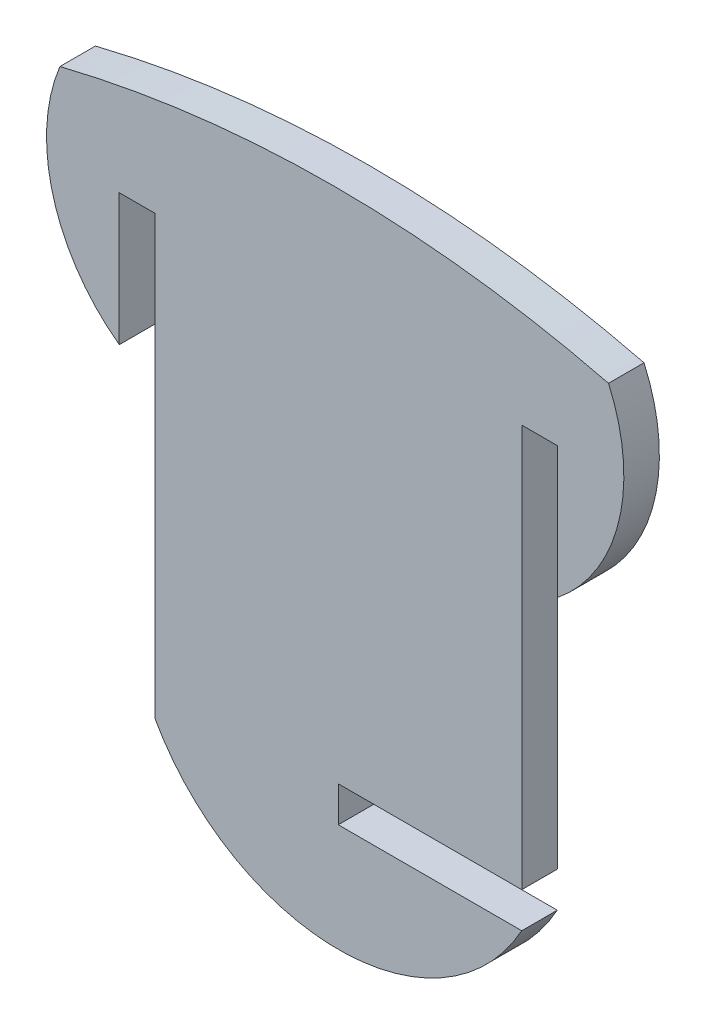
ISO-10303-21;
HEADER;
FILE_DESCRIPTION(('STEP AP214'),'2;1');
FILE_NAME('part.step','',(''),(''),'','','');
FILE_SCHEMA(('AUTOMOTIVE_DESIGN { 1 0 10303 214 1 1 1 1 }'));
ENDSEC;
DATA;
#1=APPLICATION_CONTEXT('core data for automotive mechanical design processes');
#2=APPLICATION_PROTOCOL_DEFINITION('international standard','automotive_design',2000,#1);
#3=PRODUCT_CONTEXT('',#1,'mechanical');
#4=PRODUCT('Part','Part','',(#3));
#5=PRODUCT_RELATED_PRODUCT_CATEGORY('part','',(#4));
#6=PRODUCT_DEFINITION_FORMATION('','',#4);
#7=PRODUCT_DEFINITION_CONTEXT('part definition',#1,'design');
#8=PRODUCT_DEFINITION('design','',#6,#7);
#9=PRODUCT_DEFINITION_SHAPE('','',#8);
#10=(LENGTH_UNIT() NAMED_UNIT(*) SI_UNIT(.MILLI.,.METRE.));
#11=(NAMED_UNIT(*) PLANE_ANGLE_UNIT() SI_UNIT($,.RADIAN.));
#12=(NAMED_UNIT(*) SI_UNIT($,.STERADIAN.) SOLID_ANGLE_UNIT());
#13=UNCERTAINTY_MEASURE_WITH_UNIT(LENGTH_MEASURE(1.E-05),#10,'distance_accuracy_value','');
#14=(GEOMETRIC_REPRESENTATION_CONTEXT(3) GLOBAL_UNCERTAINTY_ASSIGNED_CONTEXT((#13)) GLOBAL_UNIT_ASSIGNED_CONTEXT((#10,
#11,#12)) REPRESENTATION_CONTEXT('',''));
#15=CARTESIAN_POINT('',(0.,0.,0.));
#16=DIRECTION('',(0.,0.,1.));
#17=DIRECTION('',(1.,0.,0.));
#18=AXIS2_PLACEMENT_3D('',#15,#16,#17);
#19=CARTESIAN_POINT('',(327.434465654094,72.761168779434,2.99999999999986));
#20=DIRECTION('',(0.,1.,0.));
#21=DIRECTION('',(0.,0.,1.));
#22=AXIS2_PLACEMENT_3D('',#19,#20,#21);
#23=PLANE('',#22);
#24=DIRECTION('',(0.999999999999999,0.,0.));
#25=VECTOR('',#24,1.);
#26=CARTESIAN_POINT('',(327.434465654094,72.7611687794339,-1.11022302462516E-13));
#27=LINE('',#26,#25);
#28=CARTESIAN_POINT('',(324.434465654094,72.7611687794339,-1.2490009027033E-13));
#29=VERTEX_POINT('',#28);
#30=CARTESIAN_POINT('',(327.434465654094,72.7611687794339,-1.11022302462516E-13));
#31=VERTEX_POINT('',#30);
#32=EDGE_CURVE('E130',#29,#31,#27,.T.);
#33=ORIENTED_EDGE('',*,*,#32,.T.);
#34=DIRECTION('',(0.,0.,-1.));
#35=VECTOR('',#34,1.);
#36=CARTESIAN_POINT('',(327.434465654094,72.761168779434,2.99999999999986));
#37=LINE('',#36,#35);
#38=CARTESIAN_POINT('',(327.434465654094,72.761168779434,2.99999999999986));
#39=VERTEX_POINT('',#38);
#40=EDGE_CURVE('E11',#39,#31,#37,.T.);
#41=ORIENTED_EDGE('',*,*,#40,.F.);
#42=DIRECTION('',(0.999999999999999,0.,0.));
#43=VECTOR('',#42,1.);
#44=CARTESIAN_POINT('',(327.434465654094,72.761168779434,2.99999999999986));
#45=LINE('',#44,#43);
#46=CARTESIAN_POINT('',(324.434465654094,72.7611687794339,2.99999999999988));
#47=VERTEX_POINT('',#46);
#48=EDGE_CURVE('E167',#47,#39,#45,.T.);
#49=ORIENTED_EDGE('',*,*,#48,.F.);
#50=DIRECTION('',(0.,0.,-1.));
#51=VECTOR('',#50,1.);
#52=CARTESIAN_POINT('',(324.434465654094,72.7611687794339,2.99999999999988));
#53=LINE('',#52,#51);
#54=EDGE_CURVE('E143',#47,#29,#53,.T.);
#55=ORIENTED_EDGE('',*,*,#54,.T.);
#56=EDGE_LOOP('',(#33,#41,#49,#55));
#57=FACE_BOUND('',#56,.T.);
#58=ADVANCED_FACE('F32',(#57),#23,.F.);
#59=CARTESIAN_POINT('',(327.434465654094,72.761168779434,2.99999999999986));
#60=DIRECTION('',(0.999999999999999,0.,0.));
#61=DIRECTION('',(0.,0.,-1.));
#62=AXIS2_PLACEMENT_3D('',#59,#60,#61);
#63=PLANE('',#62);
#64=DIRECTION('',(0.,-1.,0.));
#65=VECTOR('',#64,1.);
#66=CARTESIAN_POINT('',(327.434465654094,72.7611687794339,-1.11022302462516E-13));
#67=LINE('',#66,#65);
#68=CARTESIAN_POINT('',(327.434465654094,61.6387915545949,-1.11022302462516E-13));
#69=VERTEX_POINT('',#68);
#70=EDGE_CURVE('E126',#31,#69,#67,.T.);
#71=ORIENTED_EDGE('',*,*,#70,.T.);
#72=DIRECTION('',(0.,0.,-1.));
#73=VECTOR('',#72,1.);
#74=CARTESIAN_POINT('',(327.434465654094,61.6387915545948,2.99999999999988));
#75=LINE('',#74,#73);
#76=CARTESIAN_POINT('',(327.434465654094,61.6387915545948,2.99999999999988));
#77=VERTEX_POINT('',#76);
#78=EDGE_CURVE('E39',#77,#69,#75,.T.);
#79=ORIENTED_EDGE('',*,*,#78,.F.);
#80=DIRECTION('',(0.,-1.,0.));
#81=VECTOR('',#80,1.);
#82=CARTESIAN_POINT('',(327.434465654094,72.761168779434,2.99999999999986));
#83=LINE('',#82,#81);
#84=EDGE_CURVE('E139',#39,#77,#83,.T.);
#85=ORIENTED_EDGE('',*,*,#84,.F.);
#86=ORIENTED_EDGE('',*,*,#40,.T.);
#87=EDGE_LOOP('',(#71,#79,#85,#86));
#88=FACE_BOUND('',#87,.T.);
#89=ADVANCED_FACE('F138',(#88),#63,.F.);
#90=CARTESIAN_POINT('',(318.012397008816,73.3703082830045,2.99999999999991));
#91=DIRECTION('',(0.,0.,-1.));
#92=DIRECTION('',(-0.999999999999999,0.,0.));
#93=AXIS2_PLACEMENT_3D('',#90,#91,#92);
#94=CYLINDRICAL_SURFACE('',#93,15.0467226433296);
#95=CARTESIAN_POINT('',(318.012397008816,73.3703082830045,-1.11022302462516E-13));
#96=DIRECTION('',(0.,0.,1.));
#97=DIRECTION('',(0.999999999999999,0.,0.));
#98=AXIS2_PLACEMENT_3D('',#95,#96,#97);
#99=CIRCLE('',#98,15.0467226433296);
#100=CARTESIAN_POINT('',(331.761917416063,79.4821452307635,-1.11022302462516E-13));
#101=VERTEX_POINT('',#100);
#102=EDGE_CURVE('E132',#69,#101,#99,.T.);
#103=ORIENTED_EDGE('',*,*,#102,.T.);
#104=DIRECTION('',(0.,0.,-1.));
#105=VECTOR('',#104,1.);
#106=CARTESIAN_POINT('',(331.761917416063,79.4821452307635,2.99999999999991));
#107=LINE('',#106,#105);
#108=CARTESIAN_POINT('',(331.761917416063,79.4821452307635,2.99999999999991));
#109=VERTEX_POINT('',#108);
#110=EDGE_CURVE('E218',#109,#101,#107,.T.);
#111=ORIENTED_EDGE('',*,*,#110,.F.);
#112=CARTESIAN_POINT('',(318.012397008816,73.3703082830045,2.99999999999991));
#113=DIRECTION('',(0.,0.,1.));
#114=DIRECTION('',(0.999999999999999,0.,0.));
#115=AXIS2_PLACEMENT_3D('',#112,#113,#114);
#116=CIRCLE('',#115,15.0467226433296);
#117=EDGE_CURVE('E170',#77,#109,#116,.T.);
#118=ORIENTED_EDGE('',*,*,#117,.F.);
#119=ORIENTED_EDGE('',*,*,#78,.T.);
#120=EDGE_LOOP('',(#103,#111,#118,#119));
#121=FACE_BOUND('',#120,.T.);
#122=ADVANCED_FACE('F222',(#121),#94,.T.);
#123=CARTESIAN_POINT('',(308.587397345576,-13.9267500828159,2.99999999999991));
#124=DIRECTION('',(0.,0.,-1.));
#125=DIRECTION('',(-0.999999999999999,0.,0.));
#126=AXIS2_PLACEMENT_3D('',#123,#124,#125);
#127=CYLINDRICAL_SURFACE('',#126,96.2407403556345);
#128=CARTESIAN_POINT('',(308.587397345576,-13.9267500828159,-1.2490009027033E-13));
#129=DIRECTION('',(0.,0.,1.));
#130=DIRECTION('',(0.999999999999999,0.,0.));
#131=AXIS2_PLACEMENT_3D('',#128,#129,#130);
#132=CIRCLE('',#131,96.2407403556345);
#133=CARTESIAN_POINT('',(285.421828232529,79.4843654863138,0.));
#134=VERTEX_POINT('',#133);
#135=EDGE_CURVE('E147',#101,#134,#132,.T.);
#136=ORIENTED_EDGE('',*,*,#135,.T.);
#137=DIRECTION('',(0.,0.,-1.));
#138=VECTOR('',#137,1.);
#139=CARTESIAN_POINT('',(285.421828232529,79.4843654863138,2.99999999999989));
#140=LINE('',#139,#138);
#141=CARTESIAN_POINT('',(285.421828232529,79.4843654863138,2.99999999999989));
#142=VERTEX_POINT('',#141);
#143=EDGE_CURVE('E215',#142,#134,#140,.T.);
#144=ORIENTED_EDGE('',*,*,#143,.F.);
#145=CARTESIAN_POINT('',(308.587397345576,-13.9267500828159,2.99999999999991));
#146=DIRECTION('',(0.,0.,1.));
#147=DIRECTION('',(0.999999999999999,0.,0.));
#148=AXIS2_PLACEMENT_3D('',#145,#146,#147);
#149=CIRCLE('',#148,96.2407403556345);
#150=EDGE_CURVE('E172',#109,#142,#149,.T.);
#151=ORIENTED_EDGE('',*,*,#150,.F.);
#152=ORIENTED_EDGE('',*,*,#110,.T.);
#153=EDGE_LOOP('',(#136,#144,#151,#152));
#154=FACE_BOUND('',#153,.T.);
#155=ADVANCED_FACE('F230',(#154),#127,.T.);
#156=CARTESIAN_POINT('',(299.340026915043,73.7670577510794,2.99999999999989));
#157=DIRECTION('',(0.,0.,-1.));
#158=DIRECTION('',(-0.999999999999999,0.,0.));
#159=AXIS2_PLACEMENT_3D('',#156,#157,#158);
#160=CYLINDRICAL_SURFACE('',#159,15.0467226433296);
#161=CARTESIAN_POINT('',(299.340026915043,73.7670577510793,0.));
#162=DIRECTION('',(0.,0.,1.));
#163=DIRECTION('',(0.999999999999999,0.,0.));
#164=AXIS2_PLACEMENT_3D('',#161,#162,#163);
#165=CIRCLE('',#164,15.0467226433296);
#166=CARTESIAN_POINT('',(290.434465654095,61.6387915545949,-1.2490009027033E-13));
#167=VERTEX_POINT('',#166);
#168=EDGE_CURVE('E149',#134,#167,#165,.T.);
#169=ORIENTED_EDGE('',*,*,#168,.T.);
#170=DIRECTION('',(0.,0.,-1.));
#171=VECTOR('',#170,1.);
#172=CARTESIAN_POINT('',(290.434465654095,61.6387915545948,2.99999999999989));
#173=LINE('',#172,#171);
#174=CARTESIAN_POINT('',(290.434465654095,61.6387915545948,2.99999999999989));
#175=VERTEX_POINT('',#174);
#176=EDGE_CURVE('E212',#175,#167,#173,.T.);
#177=ORIENTED_EDGE('',*,*,#176,.F.);
#178=CARTESIAN_POINT('',(299.340026915043,73.7670577510794,2.99999999999989));
#179=DIRECTION('',(0.,0.,1.));
#180=DIRECTION('',(0.999999999999999,0.,0.));
#181=AXIS2_PLACEMENT_3D('',#178,#179,#180);
#182=CIRCLE('',#181,15.0467226433296);
#183=EDGE_CURVE('E174',#142,#175,#182,.T.);
#184=ORIENTED_EDGE('',*,*,#183,.F.);
#185=ORIENTED_EDGE('',*,*,#143,.T.);
#186=EDGE_LOOP('',(#169,#177,#184,#185));
#187=FACE_BOUND('',#186,.T.);
#188=ADVANCED_FACE('F233',(#187),#160,.T.);
#189=CARTESIAN_POINT('',(290.434465654094,72.761168779434,2.99999999999988));
#190=DIRECTION('',(-0.999999999999999,0.,0.));
#191=DIRECTION('',(0.,0.,1.));
#192=AXIS2_PLACEMENT_3D('',#189,#190,#191);
#193=PLANE('',#192);
#194=DIRECTION('',(0.,1.,0.));
#195=VECTOR('',#194,1.);
#196=CARTESIAN_POINT('',(290.434465654094,72.7611687794339,-1.11022302462516E-13));
#197=LINE('',#196,#195);
#198=CARTESIAN_POINT('',(290.434465654094,72.7611687794339,-1.11022302462516E-13));
#199=VERTEX_POINT('',#198);
#200=EDGE_CURVE('E151',#167,#199,#197,.T.);
#201=ORIENTED_EDGE('',*,*,#200,.T.);
#202=DIRECTION('',(0.,0.,-1.));
#203=VECTOR('',#202,1.);
#204=CARTESIAN_POINT('',(290.434465654094,72.761168779434,2.99999999999988));
#205=LINE('',#204,#203);
#206=CARTESIAN_POINT('',(290.434465654094,72.761168779434,2.99999999999988));
#207=VERTEX_POINT('',#206);
#208=EDGE_CURVE('E209',#207,#199,#205,.T.);
#209=ORIENTED_EDGE('',*,*,#208,.F.);
#210=DIRECTION('',(0.,1.,0.));
#211=VECTOR('',#210,1.);
#212=CARTESIAN_POINT('',(290.434465654094,72.761168779434,2.99999999999988));
#213=LINE('',#212,#211);
#214=EDGE_CURVE('E176',#175,#207,#213,.T.);
#215=ORIENTED_EDGE('',*,*,#214,.F.);
#216=ORIENTED_EDGE('',*,*,#176,.T.);
#217=EDGE_LOOP('',(#201,#209,#215,#216));
#218=FACE_BOUND('',#217,.T.);
#219=ADVANCED_FACE('F238',(#218),#193,.F.);
#220=CARTESIAN_POINT('',(290.434465654094,72.761168779434,2.99999999999988));
#221=DIRECTION('',(0.,1.,0.));
#222=DIRECTION('',(0.,0.,1.));
#223=AXIS2_PLACEMENT_3D('',#220,#221,#222);
#224=PLANE('',#223);
#225=DIRECTION('',(0.999999999999999,0.,0.));
#226=VECTOR('',#225,1.);
#227=CARTESIAN_POINT('',(290.434465654094,72.7611687794339,-1.11022302462516E-13));
#228=LINE('',#227,#226);
#229=CARTESIAN_POINT('',(293.434465654094,72.7611687794339,-1.11022302462516E-13));
#230=VERTEX_POINT('',#229);
#231=EDGE_CURVE('E153',#199,#230,#228,.T.);
#232=ORIENTED_EDGE('',*,*,#231,.T.);
#233=DIRECTION('',(0.,0.,-1.));
#234=VECTOR('',#233,1.);
#235=CARTESIAN_POINT('',(293.434465654094,72.7611687794339,2.99999999999991));
#236=LINE('',#235,#234);
#237=CARTESIAN_POINT('',(293.434465654094,72.7611687794339,2.99999999999991));
#238=VERTEX_POINT('',#237);
#239=EDGE_CURVE('E206',#238,#230,#236,.T.);
#240=ORIENTED_EDGE('',*,*,#239,.F.);
#241=DIRECTION('',(0.999999999999999,0.,0.));
#242=VECTOR('',#241,1.);
#243=CARTESIAN_POINT('',(290.434465654094,72.761168779434,2.99999999999988));
#244=LINE('',#243,#242);
#245=EDGE_CURVE('E178',#207,#238,#244,.T.);
#246=ORIENTED_EDGE('',*,*,#245,.F.);
#247=ORIENTED_EDGE('',*,*,#208,.T.);
#248=EDGE_LOOP('',(#232,#240,#246,#247));
#249=FACE_BOUND('',#248,.T.);
#250=ADVANCED_FACE('F244',(#249),#224,.F.);
#251=CARTESIAN_POINT('',(293.434465654094,72.7611687794339,2.99999999999991));
#252=DIRECTION('',(0.999999999999999,0.,0.));
#253=DIRECTION('',(0.,0.,-1.));
#254=AXIS2_PLACEMENT_3D('',#251,#252,#253);
#255=PLANE('',#254);
#256=DIRECTION('',(0.,-1.,0.));
#257=VECTOR('',#256,1.);
#258=CARTESIAN_POINT('',(293.434465654094,72.7611687794339,-1.11022302462516E-13));
#259=LINE('',#258,#257);
#260=CARTESIAN_POINT('',(293.434465654094,35.8471627928168,0.));
#261=VERTEX_POINT('',#260);
#262=EDGE_CURVE('E155',#230,#261,#259,.T.);
#263=ORIENTED_EDGE('',*,*,#262,.T.);
#264=DIRECTION('',(0.,0.,-1.));
#265=VECTOR('',#264,1.);
#266=CARTESIAN_POINT('',(293.434465654094,35.8471627928169,2.99999999999993));
#267=LINE('',#266,#265);
#268=CARTESIAN_POINT('',(293.434465654094,35.8471627928169,2.99999999999993));
#269=VERTEX_POINT('',#268);
#270=EDGE_CURVE('E203',#269,#261,#267,.T.);
#271=ORIENTED_EDGE('',*,*,#270,.F.);
#272=DIRECTION('',(0.,-1.,0.));
#273=VECTOR('',#272,1.);
#274=CARTESIAN_POINT('',(293.434465654094,72.7611687794339,2.99999999999991));
#275=LINE('',#274,#273);
#276=EDGE_CURVE('E180',#238,#269,#275,.T.);
#277=ORIENTED_EDGE('',*,*,#276,.F.);
#278=ORIENTED_EDGE('',*,*,#239,.T.);
#279=EDGE_LOOP('',(#263,#271,#277,#278));
#280=FACE_BOUND('',#279,.T.);
#281=ADVANCED_FACE('F248',(#280),#255,.F.);
#282=CARTESIAN_POINT('',(308.954851555614,44.3510406640197,2.99999999999992));
#283=DIRECTION('',(0.,0.,-1.));
#284=DIRECTION('',(-0.999999999999999,0.,0.));
#285=AXIS2_PLACEMENT_3D('',#282,#283,#284);
#286=CYLINDRICAL_SURFACE('',#285,17.6974099059842);
#287=CARTESIAN_POINT('',(308.954851555614,44.3510406640197,-1.11022302462516E-13));
#288=DIRECTION('',(0.,0.,1.));
#289=DIRECTION('',(0.999999999999999,0.,0.));
#290=AXIS2_PLACEMENT_3D('',#287,#288,#289);
#291=CIRCLE('',#290,17.6974099059842);
#292=CARTESIAN_POINT('',(324.434465654094,35.7731700225049,0.));
#293=VERTEX_POINT('',#292);
#294=EDGE_CURVE('E157',#261,#293,#291,.T.);
#295=ORIENTED_EDGE('',*,*,#294,.T.);
#296=DIRECTION('',(0.,0.,-1.));
#297=VECTOR('',#296,1.);
#298=CARTESIAN_POINT('',(324.434465654094,35.7731700225049,2.99999999999991));
#299=LINE('',#298,#297);
#300=CARTESIAN_POINT('',(324.434465654094,35.7731700225049,2.99999999999991));
#301=VERTEX_POINT('',#300);
#302=EDGE_CURVE('E200',#301,#293,#299,.T.);
#303=ORIENTED_EDGE('',*,*,#302,.F.);
#304=CARTESIAN_POINT('',(308.954851555614,44.3510406640197,2.99999999999992));
#305=DIRECTION('',(0.,0.,1.));
#306=DIRECTION('',(0.999999999999999,0.,0.));
#307=AXIS2_PLACEMENT_3D('',#304,#305,#306);
#308=CIRCLE('',#307,17.6974099059842);
#309=EDGE_CURVE('E182',#269,#301,#308,.T.);
#310=ORIENTED_EDGE('',*,*,#309,.F.);
#311=ORIENTED_EDGE('',*,*,#270,.T.);
#312=EDGE_LOOP('',(#295,#303,#310,#311));
#313=FACE_BOUND('',#312,.T.);
#314=ADVANCED_FACE('F253',(#313),#286,.T.);
#315=CARTESIAN_POINT('',(308.934465654094,35.7731700225049,2.99999999999992));
#316=DIRECTION('',(0.,-1.,0.));
#317=DIRECTION('',(0.999999999999999,0.,0.));
#318=AXIS2_PLACEMENT_3D('',#315,#316,#317);
#319=PLANE('',#318);
#320=DIRECTION('',(-0.999999999999999,0.,0.));
#321=VECTOR('',#320,1.);
#322=CARTESIAN_POINT('',(308.934465654094,35.773170022505,0.));
#323=LINE('',#322,#321);
#324=CARTESIAN_POINT('',(308.934465654094,35.773170022505,0.));
#325=VERTEX_POINT('',#324);
#326=EDGE_CURVE('E159',#293,#325,#323,.T.);
#327=ORIENTED_EDGE('',*,*,#326,.T.);
#328=DIRECTION('',(0.,0.,-1.));
#329=VECTOR('',#328,1.);
#330=CARTESIAN_POINT('',(308.934465654094,35.7731700225049,2.99999999999992));
#331=LINE('',#330,#329);
#332=CARTESIAN_POINT('',(308.934465654094,35.7731700225049,2.99999999999992));
#333=VERTEX_POINT('',#332);
#334=EDGE_CURVE('E197',#333,#325,#331,.T.);
#335=ORIENTED_EDGE('',*,*,#334,.F.);
#336=DIRECTION('',(-0.999999999999999,0.,0.));
#337=VECTOR('',#336,1.);
#338=CARTESIAN_POINT('',(308.934465654094,35.7731700225049,2.99999999999992));
#339=LINE('',#338,#337);
#340=EDGE_CURVE('E184',#301,#333,#339,.T.);
#341=ORIENTED_EDGE('',*,*,#340,.F.);
#342=ORIENTED_EDGE('',*,*,#302,.T.);
#343=EDGE_LOOP('',(#327,#335,#341,#342));
#344=FACE_BOUND('',#343,.T.);
#345=ADVANCED_FACE('F259',(#344),#319,.F.);
#346=CARTESIAN_POINT('',(308.934465654094,38.773170022505,2.99999999999992));
#347=DIRECTION('',(-0.999999999999999,0.,0.));
#348=DIRECTION('',(0.,0.,1.));
#349=AXIS2_PLACEMENT_3D('',#346,#347,#348);
#350=PLANE('',#349);
#351=DIRECTION('',(0.,1.,0.));
#352=VECTOR('',#351,1.);
#353=CARTESIAN_POINT('',(308.934465654094,38.7731700225049,-1.11022302462516E-13));
#354=LINE('',#353,#352);
#355=CARTESIAN_POINT('',(308.934465654094,38.7731700225049,-1.11022302462516E-13));
#356=VERTEX_POINT('',#355);
#357=EDGE_CURVE('E161',#325,#356,#354,.T.);
#358=ORIENTED_EDGE('',*,*,#357,.T.);
#359=DIRECTION('',(0.,0.,-1.));
#360=VECTOR('',#359,1.);
#361=CARTESIAN_POINT('',(308.934465654094,38.773170022505,2.99999999999992));
#362=LINE('',#361,#360);
#363=CARTESIAN_POINT('',(308.934465654094,38.773170022505,2.99999999999992));
#364=VERTEX_POINT('',#363);
#365=EDGE_CURVE('E194',#364,#356,#362,.T.);
#366=ORIENTED_EDGE('',*,*,#365,.F.);
#367=DIRECTION('',(0.,1.,0.));
#368=VECTOR('',#367,1.);
#369=CARTESIAN_POINT('',(308.934465654094,38.773170022505,2.99999999999992));
#370=LINE('',#369,#368);
#371=EDGE_CURVE('E186',#333,#364,#370,.T.);
#372=ORIENTED_EDGE('',*,*,#371,.F.);
#373=ORIENTED_EDGE('',*,*,#334,.T.);
#374=EDGE_LOOP('',(#358,#366,#372,#373));
#375=FACE_BOUND('',#374,.T.);
#376=ADVANCED_FACE('F263',(#375),#350,.F.);
#377=CARTESIAN_POINT('',(324.434465654094,38.7731700225049,2.99999999999989));
#378=DIRECTION('',(0.,1.,0.));
#379=DIRECTION('',(-0.999999999999999,0.,0.));
#380=AXIS2_PLACEMENT_3D('',#377,#378,#379);
#381=PLANE('',#380);
#382=DIRECTION('',(0.999999999999999,0.,0.));
#383=VECTOR('',#382,1.);
#384=CARTESIAN_POINT('',(324.434465654094,38.773170022505,0.));
#385=LINE('',#384,#383);
#386=CARTESIAN_POINT('',(324.434465654094,38.773170022505,0.));
#387=VERTEX_POINT('',#386);
#388=EDGE_CURVE('E163',#356,#387,#385,.T.);
#389=ORIENTED_EDGE('',*,*,#388,.T.);
#390=DIRECTION('',(0.,0.,-1.));
#391=VECTOR('',#390,1.);
#392=CARTESIAN_POINT('',(324.434465654094,38.7731700225049,2.99999999999989));
#393=LINE('',#392,#391);
#394=CARTESIAN_POINT('',(324.434465654094,38.7731700225049,2.99999999999989));
#395=VERTEX_POINT('',#394);
#396=EDGE_CURVE('E191',#395,#387,#393,.T.);
#397=ORIENTED_EDGE('',*,*,#396,.F.);
#398=DIRECTION('',(0.999999999999999,0.,0.));
#399=VECTOR('',#398,1.);
#400=CARTESIAN_POINT('',(324.434465654094,38.7731700225049,2.99999999999989));
#401=LINE('',#400,#399);
#402=EDGE_CURVE('E51',#364,#395,#401,.T.);
#403=ORIENTED_EDGE('',*,*,#402,.F.);
#404=ORIENTED_EDGE('',*,*,#365,.T.);
#405=EDGE_LOOP('',(#389,#397,#403,#404));
#406=FACE_BOUND('',#405,.T.);
#407=ADVANCED_FACE('F266',(#406),#381,.F.);
#408=CARTESIAN_POINT('',(324.434465654094,72.7611687794339,2.99999999999988));
#409=DIRECTION('',(-0.999999999999999,0.,0.));
#410=DIRECTION('',(0.,0.,1.));
#411=AXIS2_PLACEMENT_3D('',#408,#409,#410);
#412=PLANE('',#411);
#413=DIRECTION('',(0.,1.,0.));
#414=VECTOR('',#413,1.);
#415=CARTESIAN_POINT('',(324.434465654094,72.7611687794339,-1.2490009027033E-13));
#416=LINE('',#415,#414);
#417=EDGE_CURVE('E165',#387,#29,#416,.T.);
#418=ORIENTED_EDGE('',*,*,#417,.T.);
#419=ORIENTED_EDGE('',*,*,#54,.F.);
#420=DIRECTION('',(0.,1.,0.));
#421=VECTOR('',#420,1.);
#422=CARTESIAN_POINT('',(324.434465654094,72.7611687794339,2.99999999999988));
#423=LINE('',#422,#421);
#424=EDGE_CURVE('E46',#395,#47,#423,.T.);
#425=ORIENTED_EDGE('',*,*,#424,.F.);
#426=ORIENTED_EDGE('',*,*,#396,.T.);
#427=EDGE_LOOP('',(#418,#419,#425,#426));
#428=FACE_BOUND('',#427,.T.);
#429=ADVANCED_FACE('F268',(#428),#412,.F.);
#430=CARTESIAN_POINT('',(308.954851555614,44.3510406640197,2.99999999999992));
#431=DIRECTION('',(0.,0.,1.));
#432=DIRECTION('',(0.999999999999999,0.,0.));
#433=AXIS2_PLACEMENT_3D('',#430,#431,#432);
#434=PLANE('',#433);
#435=ORIENTED_EDGE('',*,*,#48,.T.);
#436=ORIENTED_EDGE('',*,*,#84,.T.);
#437=ORIENTED_EDGE('',*,*,#117,.T.);
#438=ORIENTED_EDGE('',*,*,#150,.T.);
#439=ORIENTED_EDGE('',*,*,#183,.T.);
#440=ORIENTED_EDGE('',*,*,#214,.T.);
#441=ORIENTED_EDGE('',*,*,#245,.T.);
#442=ORIENTED_EDGE('',*,*,#276,.T.);
#443=ORIENTED_EDGE('',*,*,#309,.T.);
#444=ORIENTED_EDGE('',*,*,#340,.T.);
#445=ORIENTED_EDGE('',*,*,#371,.T.);
#446=ORIENTED_EDGE('',*,*,#402,.T.);
#447=ORIENTED_EDGE('',*,*,#424,.T.);
#448=EDGE_LOOP('',(#435,#436,#437,#438,#439,#440,#441,#442,#443,#444,#445,#446,#447));
#449=FACE_BOUND('',#448,.T.);
#450=ADVANCED_FACE('F225',(#449),#434,.T.);
#451=CARTESIAN_POINT('',(308.954851555614,44.3510406640197,-1.11022302462516E-13));
#452=DIRECTION('',(0.,0.,1.));
#453=DIRECTION('',(0.999999999999999,0.,0.));
#454=AXIS2_PLACEMENT_3D('',#451,#452,#453);
#455=PLANE('',#454);
#456=ORIENTED_EDGE('',*,*,#32,.F.);
#457=ORIENTED_EDGE('',*,*,#417,.F.);
#458=ORIENTED_EDGE('',*,*,#388,.F.);
#459=ORIENTED_EDGE('',*,*,#357,.F.);
#460=ORIENTED_EDGE('',*,*,#326,.F.);
#461=ORIENTED_EDGE('',*,*,#294,.F.);
#462=ORIENTED_EDGE('',*,*,#262,.F.);
#463=ORIENTED_EDGE('',*,*,#231,.F.);
#464=ORIENTED_EDGE('',*,*,#200,.F.);
#465=ORIENTED_EDGE('',*,*,#168,.F.);
#466=ORIENTED_EDGE('',*,*,#135,.F.);
#467=ORIENTED_EDGE('',*,*,#102,.F.);
#468=ORIENTED_EDGE('',*,*,#70,.F.);
#469=EDGE_LOOP('',(#456,#457,#458,#459,#460,#461,#462,#463,#464,#465,#466,#467,#468));
#470=FACE_BOUND('',#469,.T.);
#471=ADVANCED_FACE('F127',(#470),#455,.F.);
#472=CLOSED_SHELL('',(#58,#89,#122,#155,#188,#219,#250,#281,#314,#345,#376,#407,#429,#450,#471));
#473=MANIFOLD_SOLID_BREP('B2',#472);
#474=ADVANCED_BREP_SHAPE_REPRESENTATION('',(#18,#473),#14);
#475=SHAPE_DEFINITION_REPRESENTATION(#9,#474);
ENDSEC;
END-ISO-10303-21;
